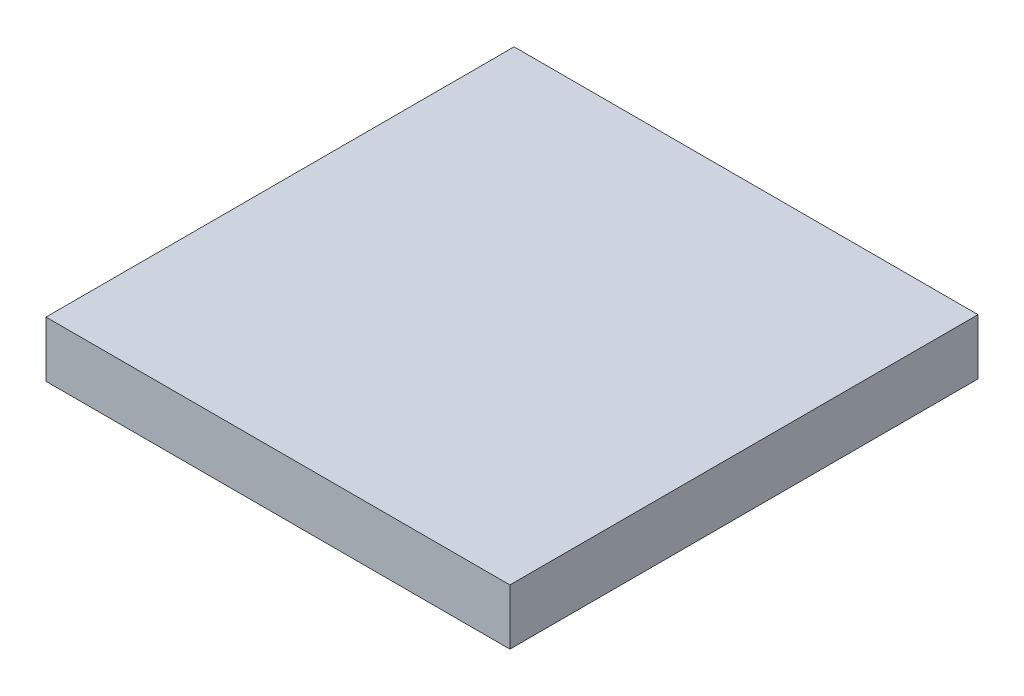
ISO-10303-21;
HEADER;
FILE_DESCRIPTION(('STEP AP214'),'2;1');
FILE_NAME('part.step','',(''),(''),'','','');
FILE_SCHEMA(('AUTOMOTIVE_DESIGN { 1 0 10303 214 1 1 1 1 }'));
ENDSEC;
DATA;
#1=APPLICATION_CONTEXT('core data for automotive mechanical design processes');
#2=APPLICATION_PROTOCOL_DEFINITION('international standard','automotive_design',2000,#1);
#3=PRODUCT_CONTEXT('',#1,'mechanical');
#4=PRODUCT('Part','Part','',(#3));
#5=PRODUCT_RELATED_PRODUCT_CATEGORY('part','',(#4));
#6=PRODUCT_DEFINITION_FORMATION('','',#4);
#7=PRODUCT_DEFINITION_CONTEXT('part definition',#1,'design');
#8=PRODUCT_DEFINITION('design','',#6,#7);
#9=PRODUCT_DEFINITION_SHAPE('','',#8);
#10=(LENGTH_UNIT() NAMED_UNIT(*) SI_UNIT(.MILLI.,.METRE.));
#11=(NAMED_UNIT(*) PLANE_ANGLE_UNIT() SI_UNIT($,.RADIAN.));
#12=(NAMED_UNIT(*) SI_UNIT($,.STERADIAN.) SOLID_ANGLE_UNIT());
#13=UNCERTAINTY_MEASURE_WITH_UNIT(LENGTH_MEASURE(1.E-05),#10,'distance_accuracy_value','');
#14=(GEOMETRIC_REPRESENTATION_CONTEXT(3) GLOBAL_UNCERTAINTY_ASSIGNED_CONTEXT((#13)) GLOBAL_UNIT_ASSIGNED_CONTEXT((#10,
#11,#12)) REPRESENTATION_CONTEXT('',''));
#15=CARTESIAN_POINT('',(0.,0.,0.));
#16=DIRECTION('',(0.,0.,1.));
#17=DIRECTION('',(1.,0.,0.));
#18=AXIS2_PLACEMENT_3D('',#15,#16,#17);
#19=CARTESIAN_POINT('',(20.,3.,20.));
#20=DIRECTION('',(0.,0.,1.));
#21=DIRECTION('',(1.,0.,0.));
#22=AXIS2_PLACEMENT_3D('',#19,#20,#21);
#23=PLANE('',#22);
#24=DIRECTION('',(-1.,0.,0.));
#25=VECTOR('',#24,1.);
#26=CARTESIAN_POINT('',(20.,0.,20.));
#27=LINE('',#26,#25);
#28=CARTESIAN_POINT('',(20.,0.,20.));
#29=VERTEX_POINT('',#28);
#30=CARTESIAN_POINT('',(-4.99999999999985,0.,20.));
#31=VERTEX_POINT('',#30);
#32=EDGE_CURVE('E119',#29,#31,#27,.T.);
#33=ORIENTED_EDGE('',*,*,#32,.F.);
#34=DIRECTION('',(0.,-1.,0.));
#35=VECTOR('',#34,1.);
#36=CARTESIAN_POINT('',(20.,3.,20.));
#37=LINE('',#36,#35);
#38=CARTESIAN_POINT('',(20.,3.,20.));
#39=VERTEX_POINT('',#38);
#40=EDGE_CURVE('E13',#39,#29,#37,.T.);
#41=ORIENTED_EDGE('',*,*,#40,.F.);
#42=DIRECTION('',(-1.,0.,0.));
#43=VECTOR('',#42,1.);
#44=CARTESIAN_POINT('',(20.,3.,20.));
#45=LINE('',#44,#43);
#46=CARTESIAN_POINT('',(-4.99999999999985,3.,20.));
#47=VERTEX_POINT('',#46);
#48=EDGE_CURVE('E113',#39,#47,#45,.T.);
#49=ORIENTED_EDGE('',*,*,#48,.T.);
#50=DIRECTION('',(0.,-1.,0.));
#51=VECTOR('',#50,1.);
#52=CARTESIAN_POINT('',(-4.99999999999985,3.,20.));
#53=LINE('',#52,#51);
#54=EDGE_CURVE('E92',#47,#31,#53,.T.);
#55=ORIENTED_EDGE('',*,*,#54,.T.);
#56=EDGE_LOOP('',(#33,#41,#49,#55));
#57=FACE_BOUND('',#56,.T.);
#58=ADVANCED_FACE('F51',(#57),#23,.T.);
#59=CARTESIAN_POINT('',(20.,3.,20.));
#60=DIRECTION('',(-1.,0.,0.));
#61=DIRECTION('',(0.,0.,1.));
#62=AXIS2_PLACEMENT_3D('',#59,#60,#61);
#63=PLANE('',#62);
#64=DIRECTION('',(0.,0.,-1.));
#65=VECTOR('',#64,1.);
#66=CARTESIAN_POINT('',(20.,0.,20.));
#67=LINE('',#66,#65);
#68=CARTESIAN_POINT('',(20.,0.,-5.22650515986531));
#69=VERTEX_POINT('',#68);
#70=EDGE_CURVE('E84',#29,#69,#67,.T.);
#71=ORIENTED_EDGE('',*,*,#70,.T.);
#72=DIRECTION('',(0.,-1.,0.));
#73=VECTOR('',#72,1.);
#74=CARTESIAN_POINT('',(20.,3.,-5.22650515986531));
#75=LINE('',#74,#73);
#76=CARTESIAN_POINT('',(20.,3.,-5.22650515986531));
#77=VERTEX_POINT('',#76);
#78=EDGE_CURVE('E60',#77,#69,#75,.T.);
#79=ORIENTED_EDGE('',*,*,#78,.F.);
#80=DIRECTION('',(0.,0.,-1.));
#81=VECTOR('',#80,1.);
#82=CARTESIAN_POINT('',(20.,3.,20.));
#83=LINE('',#82,#81);
#84=EDGE_CURVE('E102',#39,#77,#83,.T.);
#85=ORIENTED_EDGE('',*,*,#84,.F.);
#86=ORIENTED_EDGE('',*,*,#40,.T.);
#87=EDGE_LOOP('',(#71,#79,#85,#86));
#88=FACE_BOUND('',#87,.T.);
#89=ADVANCED_FACE('F242',(#88),#63,.F.);
#90=CARTESIAN_POINT('',(20.,3.,-5.22650515986531));
#91=DIRECTION('',(0.,0.,1.));
#92=DIRECTION('',(1.,0.,0.));
#93=AXIS2_PLACEMENT_3D('',#90,#91,#92);
#94=PLANE('',#93);
#95=DIRECTION('',(-1.,0.,0.));
#96=VECTOR('',#95,1.);
#97=CARTESIAN_POINT('',(20.,0.,-5.22650515986531));
#98=LINE('',#97,#96);
#99=CARTESIAN_POINT('',(-4.99999999999985,0.,-5.22650515986531));
#100=VERTEX_POINT('',#99);
#101=EDGE_CURVE('E109',#69,#100,#98,.T.);
#102=ORIENTED_EDGE('',*,*,#101,.T.);
#103=DIRECTION('',(0.,-1.,0.));
#104=VECTOR('',#103,1.);
#105=CARTESIAN_POINT('',(-4.99999999999985,3.,-5.22650515986531));
#106=LINE('',#105,#104);
#107=CARTESIAN_POINT('',(-4.99999999999985,3.,-5.22650515986531));
#108=VERTEX_POINT('',#107);
#109=EDGE_CURVE('E106',#108,#100,#106,.T.);
#110=ORIENTED_EDGE('',*,*,#109,.F.);
#111=DIRECTION('',(-1.,0.,0.));
#112=VECTOR('',#111,1.);
#113=CARTESIAN_POINT('',(20.,3.,-5.22650515986531));
#114=LINE('',#113,#112);
#115=EDGE_CURVE('E97',#77,#108,#114,.T.);
#116=ORIENTED_EDGE('',*,*,#115,.F.);
#117=ORIENTED_EDGE('',*,*,#78,.T.);
#118=EDGE_LOOP('',(#102,#110,#116,#117));
#119=FACE_BOUND('',#118,.T.);
#120=ADVANCED_FACE('F107',(#119),#94,.F.);
#121=CARTESIAN_POINT('',(-4.99999999999985,3.,20.));
#122=DIRECTION('',(-1.,0.,0.));
#123=DIRECTION('',(0.,0.,1.));
#124=AXIS2_PLACEMENT_3D('',#121,#122,#123);
#125=PLANE('',#124);
#126=DIRECTION('',(0.,0.,-1.));
#127=VECTOR('',#126,1.);
#128=CARTESIAN_POINT('',(-4.99999999999985,0.,20.));
#129=LINE('',#128,#127);
#130=EDGE_CURVE('E122',#31,#100,#129,.T.);
#131=ORIENTED_EDGE('',*,*,#130,.F.);
#132=ORIENTED_EDGE('',*,*,#54,.F.);
#133=DIRECTION('',(0.,0.,-1.));
#134=VECTOR('',#133,1.);
#135=CARTESIAN_POINT('',(-4.99999999999985,3.,20.));
#136=LINE('',#135,#134);
#137=EDGE_CURVE('E101',#47,#108,#136,.T.);
#138=ORIENTED_EDGE('',*,*,#137,.T.);
#139=ORIENTED_EDGE('',*,*,#109,.T.);
#140=EDGE_LOOP('',(#131,#132,#138,#139));
#141=FACE_BOUND('',#140,.T.);
#142=ADVANCED_FACE('F112',(#141),#125,.T.);
#143=CARTESIAN_POINT('',(0.,3.,0.));
#144=DIRECTION('',(0.,-1.,0.));
#145=DIRECTION('',(0.,0.,-1.));
#146=AXIS2_PLACEMENT_3D('',#143,#144,#145);
#147=PLANE('',#146);
#148=ORIENTED_EDGE('',*,*,#48,.F.);
#149=ORIENTED_EDGE('',*,*,#84,.T.);
#150=ORIENTED_EDGE('',*,*,#115,.T.);
#151=ORIENTED_EDGE('',*,*,#137,.F.);
#152=EDGE_LOOP('',(#148,#149,#150,#151));
#153=FACE_BOUND('',#152,.T.);
#154=ADVANCED_FACE('F100',(#153),#147,.F.);
#155=CARTESIAN_POINT('',(0.,0.,0.));
#156=DIRECTION('',(0.,-1.,0.));
#157=DIRECTION('',(0.,0.,-1.));
#158=AXIS2_PLACEMENT_3D('',#155,#156,#157);
#159=PLANE('',#158);
#160=CARTESIAN_POINT('',(1.54390389361936E-13,0.,7.27349484013469));
#161=DIRECTION('',(0.,1.,0.));
#162=DIRECTION('',(0.,0.,1.));
#163=AXIS2_PLACEMENT_3D('',#160,#161,#162);
#164=CIRCLE('',#163,2.5);
#165=CARTESIAN_POINT('',(1.54390389361936E-13,0.,9.77349484013469));
#166=VERTEX_POINT('',#165);
#167=EDGE_CURVE('E187',#166,#166,#164,.T.);
#168=ORIENTED_EDGE('',*,*,#167,.T.);
#169=EDGE_LOOP('',(#168));
#170=FACE_BOUND('',#169,.T.);
#171=CARTESIAN_POINT('',(15.0000000000002,0.,-0.226505159865314));
#172=DIRECTION('',(0.,1.,0.));
#173=DIRECTION('',(0.,0.,1.));
#174=AXIS2_PLACEMENT_3D('',#171,#172,#173);
#175=CIRCLE('',#174,2.5);
#176=CARTESIAN_POINT('',(15.0000000000002,0.,2.27349484013469));
#177=VERTEX_POINT('',#176);
#178=EDGE_CURVE('E174',#177,#177,#175,.T.);
#179=ORIENTED_EDGE('',*,*,#178,.T.);
#180=EDGE_LOOP('',(#179));
#181=FACE_BOUND('',#180,.T.);
#182=CARTESIAN_POINT('',(7.50000000000015,0.,-0.226505159865314));
#183=DIRECTION('',(0.,1.,0.));
#184=DIRECTION('',(0.,0.,1.));
#185=AXIS2_PLACEMENT_3D('',#182,#183,#184);
#186=CIRCLE('',#185,2.5);
#187=CARTESIAN_POINT('',(7.50000000000015,0.,2.27349484013469));
#188=VERTEX_POINT('',#187);
#189=EDGE_CURVE('E175',#188,#188,#186,.T.);
#190=ORIENTED_EDGE('',*,*,#189,.T.);
#191=EDGE_LOOP('',(#190));
#192=FACE_BOUND('',#191,.T.);
#193=CARTESIAN_POINT('',(1.54390389361936E-13,0.,-0.226505159865314));
#194=DIRECTION('',(0.,1.,0.));
#195=DIRECTION('',(0.,0.,1.));
#196=AXIS2_PLACEMENT_3D('',#193,#194,#195);
#197=CIRCLE('',#196,2.5);
#198=CARTESIAN_POINT('',(1.54390389361936E-13,0.,2.27349484013469));
#199=VERTEX_POINT('',#198);
#200=EDGE_CURVE('E132',#199,#199,#197,.T.);
#201=ORIENTED_EDGE('',*,*,#200,.T.);
#202=EDGE_LOOP('',(#201));
#203=FACE_BOUND('',#202,.T.);
#204=CARTESIAN_POINT('',(7.50000000000015,0.,7.27349484013469));
#205=DIRECTION('',(0.,1.,0.));
#206=DIRECTION('',(0.,0.,1.));
#207=AXIS2_PLACEMENT_3D('',#204,#205,#206);
#208=CIRCLE('',#207,2.5);
#209=CARTESIAN_POINT('',(7.50000000000015,0.,9.77349484013469));
#210=VERTEX_POINT('',#209);
#211=EDGE_CURVE('E186',#210,#210,#208,.T.);
#212=ORIENTED_EDGE('',*,*,#211,.T.);
#213=EDGE_LOOP('',(#212));
#214=FACE_BOUND('',#213,.T.);
#215=CARTESIAN_POINT('',(15.0000000000002,0.,7.27349484013469));
#216=DIRECTION('',(0.,1.,0.));
#217=DIRECTION('',(0.,0.,1.));
#218=AXIS2_PLACEMENT_3D('',#215,#216,#217);
#219=CIRCLE('',#218,2.5);
#220=CARTESIAN_POINT('',(15.0000000000002,0.,9.77349484013469));
#221=VERTEX_POINT('',#220);
#222=EDGE_CURVE('E205',#221,#221,#219,.T.);
#223=ORIENTED_EDGE('',*,*,#222,.T.);
#224=EDGE_LOOP('',(#223));
#225=FACE_BOUND('',#224,.T.);
#226=CARTESIAN_POINT('',(1.54390389361936E-13,0.,14.7734948401347));
#227=DIRECTION('',(0.,1.,0.));
#228=DIRECTION('',(0.,0.,1.));
#229=AXIS2_PLACEMENT_3D('',#226,#227,#228);
#230=CIRCLE('',#229,2.5);
#231=CARTESIAN_POINT('',(1.54390389361936E-13,0.,17.2734948401347));
#232=VERTEX_POINT('',#231);
#233=EDGE_CURVE('E199',#232,#232,#230,.T.);
#234=ORIENTED_EDGE('',*,*,#233,.T.);
#235=EDGE_LOOP('',(#234));
#236=FACE_BOUND('',#235,.T.);
#237=CARTESIAN_POINT('',(7.50000000000015,0.,14.7734948401347));
#238=DIRECTION('',(0.,1.,0.));
#239=DIRECTION('',(0.,0.,1.));
#240=AXIS2_PLACEMENT_3D('',#237,#238,#239);
#241=CIRCLE('',#240,2.5);
#242=CARTESIAN_POINT('',(7.50000000000015,0.,17.2734948401347));
#243=VERTEX_POINT('',#242);
#244=EDGE_CURVE('E198',#243,#243,#241,.T.);
#245=ORIENTED_EDGE('',*,*,#244,.T.);
#246=EDGE_LOOP('',(#245));
#247=FACE_BOUND('',#246,.T.);
#248=CARTESIAN_POINT('',(15.0000000000002,0.,14.7734948401347));
#249=DIRECTION('',(0.,1.,0.));
#250=DIRECTION('',(0.,0.,1.));
#251=AXIS2_PLACEMENT_3D('',#248,#249,#250);
#252=CIRCLE('',#251,2.5);
#253=CARTESIAN_POINT('',(15.0000000000002,0.,17.2734948401347));
#254=VERTEX_POINT('',#253);
#255=EDGE_CURVE('E216',#254,#254,#252,.T.);
#256=ORIENTED_EDGE('',*,*,#255,.T.);
#257=EDGE_LOOP('',(#256));
#258=FACE_BOUND('',#257,.T.);
#259=ORIENTED_EDGE('',*,*,#32,.T.);
#260=ORIENTED_EDGE('',*,*,#130,.T.);
#261=ORIENTED_EDGE('',*,*,#101,.F.);
#262=ORIENTED_EDGE('',*,*,#70,.F.);
#263=EDGE_LOOP('',(#259,#260,#261,#262));
#264=FACE_BOUND('',#263,.T.);
#265=ADVANCED_FACE('F223',(#170,#181,#192,#203,#214,#225,#236,#247,#258,#264),#159,.T.);
#266=CARTESIAN_POINT('',(15.0000000000002,2.,14.7734948401347));
#267=DIRECTION('',(0.,-1.,0.));
#268=DIRECTION('',(0.,0.,-1.));
#269=AXIS2_PLACEMENT_3D('',#266,#267,#268);
#270=CYLINDRICAL_SURFACE('',#269,2.5);
#271=CARTESIAN_POINT('',(15.0000000000002,2.,14.7734948401347));
#272=DIRECTION('',(0.,1.,0.));
#273=DIRECTION('',(0.,0.,1.));
#274=AXIS2_PLACEMENT_3D('',#271,#272,#273);
#275=CIRCLE('',#274,2.5);
#276=CARTESIAN_POINT('',(15.0000000000002,2.,17.2734948401347));
#277=VERTEX_POINT('',#276);
#278=EDGE_CURVE('E123',#277,#277,#275,.T.);
#279=ORIENTED_EDGE('',*,*,#278,.T.);
#280=EDGE_LOOP('',(#279));
#281=FACE_BOUND('',#280,.T.);
#282=ORIENTED_EDGE('',*,*,#255,.F.);
#283=EDGE_LOOP('',(#282));
#284=FACE_BOUND('',#283,.T.);
#285=ADVANCED_FACE('F226',(#281,#284),#270,.F.);
#286=CARTESIAN_POINT('',(15.0000000000002,2.,14.7734948401347));
#287=DIRECTION('',(0.,1.,0.));
#288=DIRECTION('',(0.,0.,1.));
#289=AXIS2_PLACEMENT_3D('',#286,#287,#288);
#290=PLANE('',#289);
#291=CARTESIAN_POINT('',(15.0000000000002,2.,14.7734948401347));
#292=DIRECTION('',(0.,1.,0.));
#293=DIRECTION('',(0.,0.,1.));
#294=AXIS2_PLACEMENT_3D('',#291,#292,#293);
#295=CIRCLE('',#294,1.5);
#296=CARTESIAN_POINT('',(15.0000000000002,2.,16.2734948401347));
#297=VERTEX_POINT('',#296);
#298=EDGE_CURVE('E129',#297,#297,#295,.F.);
#299=ORIENTED_EDGE('',*,*,#298,.F.);
#300=EDGE_LOOP('',(#299));
#301=FACE_BOUND('',#300,.T.);
#302=ORIENTED_EDGE('',*,*,#278,.F.);
#303=EDGE_LOOP('',(#302));
#304=FACE_BOUND('',#303,.T.);
#305=ADVANCED_FACE('F228',(#301,#304),#290,.F.);
#306=CARTESIAN_POINT('',(7.50000000000015,2.,14.7734948401347));
#307=DIRECTION('',(0.,-1.,0.));
#308=DIRECTION('',(0.,0.,-1.));
#309=AXIS2_PLACEMENT_3D('',#306,#307,#308);
#310=CYLINDRICAL_SURFACE('',#309,2.5);
#311=CARTESIAN_POINT('',(7.50000000000015,2.,14.7734948401347));
#312=DIRECTION('',(0.,1.,0.));
#313=DIRECTION('',(0.,0.,1.));
#314=AXIS2_PLACEMENT_3D('',#311,#312,#313);
#315=CIRCLE('',#314,2.5);
#316=CARTESIAN_POINT('',(7.50000000000015,2.,17.2734948401347));
#317=VERTEX_POINT('',#316);
#318=EDGE_CURVE('E213',#317,#317,#315,.T.);
#319=ORIENTED_EDGE('',*,*,#318,.T.);
#320=EDGE_LOOP('',(#319));
#321=FACE_BOUND('',#320,.T.);
#322=ORIENTED_EDGE('',*,*,#244,.F.);
#323=EDGE_LOOP('',(#322));
#324=FACE_BOUND('',#323,.T.);
#325=ADVANCED_FACE('F235',(#321,#324),#310,.F.);
#326=CARTESIAN_POINT('',(7.50000000000015,2.,14.7734948401347));
#327=DIRECTION('',(0.,1.,0.));
#328=DIRECTION('',(0.,0.,1.));
#329=AXIS2_PLACEMENT_3D('',#326,#327,#328);
#330=PLANE('',#329);
#331=CARTESIAN_POINT('',(7.50000000000015,2.,14.7734948401347));
#332=DIRECTION('',(0.,1.,0.));
#333=DIRECTION('',(0.,0.,1.));
#334=AXIS2_PLACEMENT_3D('',#331,#332,#333);
#335=CIRCLE('',#334,1.5);
#336=CARTESIAN_POINT('',(7.50000000000015,2.,16.2734948401347));
#337=VERTEX_POINT('',#336);
#338=EDGE_CURVE('E134',#337,#337,#335,.F.);
#339=ORIENTED_EDGE('',*,*,#338,.F.);
#340=EDGE_LOOP('',(#339));
#341=FACE_BOUND('',#340,.T.);
#342=ORIENTED_EDGE('',*,*,#318,.F.);
#343=EDGE_LOOP('',(#342));
#344=FACE_BOUND('',#343,.T.);
#345=ADVANCED_FACE('F355',(#341,#344),#330,.F.);
#346=CARTESIAN_POINT('',(1.54390389361936E-13,2.,14.7734948401347));
#347=DIRECTION('',(0.,-1.,0.));
#348=DIRECTION('',(0.,0.,-1.));
#349=AXIS2_PLACEMENT_3D('',#346,#347,#348);
#350=CYLINDRICAL_SURFACE('',#349,2.5);
#351=CARTESIAN_POINT('',(1.54390389361936E-13,2.,14.7734948401347));
#352=DIRECTION('',(0.,1.,0.));
#353=DIRECTION('',(0.,0.,1.));
#354=AXIS2_PLACEMENT_3D('',#351,#352,#353);
#355=CIRCLE('',#354,2.5);
#356=CARTESIAN_POINT('',(1.54390389361936E-13,2.,17.2734948401347));
#357=VERTEX_POINT('',#356);
#358=EDGE_CURVE('E195',#357,#357,#355,.T.);
#359=ORIENTED_EDGE('',*,*,#358,.T.);
#360=EDGE_LOOP('',(#359));
#361=FACE_BOUND('',#360,.T.);
#362=ORIENTED_EDGE('',*,*,#233,.F.);
#363=EDGE_LOOP('',(#362));
#364=FACE_BOUND('',#363,.T.);
#365=ADVANCED_FACE('F359',(#361,#364),#350,.F.);
#366=CARTESIAN_POINT('',(1.54390389361936E-13,2.,14.7734948401347));
#367=DIRECTION('',(0.,1.,0.));
#368=DIRECTION('',(0.,0.,1.));
#369=AXIS2_PLACEMENT_3D('',#366,#367,#368);
#370=PLANE('',#369);
#371=CARTESIAN_POINT('',(1.54390389361936E-13,2.,14.7734948401347));
#372=DIRECTION('',(0.,1.,0.));
#373=DIRECTION('',(0.,0.,1.));
#374=AXIS2_PLACEMENT_3D('',#371,#372,#373);
#375=CIRCLE('',#374,1.5);
#376=CARTESIAN_POINT('',(1.54390389361936E-13,2.,16.2734948401347));
#377=VERTEX_POINT('',#376);
#378=EDGE_CURVE('E54',#377,#377,#375,.F.);
#379=ORIENTED_EDGE('',*,*,#378,.F.);
#380=EDGE_LOOP('',(#379));
#381=FACE_BOUND('',#380,.T.);
#382=ORIENTED_EDGE('',*,*,#358,.F.);
#383=EDGE_LOOP('',(#382));
#384=FACE_BOUND('',#383,.T.);
#385=ADVANCED_FACE('F477',(#381,#384),#370,.F.);
#386=CARTESIAN_POINT('',(15.0000000000002,2.,7.27349484013469));
#387=DIRECTION('',(0.,-1.,0.));
#388=DIRECTION('',(0.,0.,-1.));
#389=AXIS2_PLACEMENT_3D('',#386,#387,#388);
#390=CYLINDRICAL_SURFACE('',#389,2.5);
#391=CARTESIAN_POINT('',(15.0000000000002,2.,7.27349484013469));
#392=DIRECTION('',(0.,1.,0.));
#393=DIRECTION('',(0.,0.,1.));
#394=AXIS2_PLACEMENT_3D('',#391,#392,#393);
#395=CIRCLE('',#394,2.5);
#396=CARTESIAN_POINT('',(15.0000000000002,2.,9.77349484013469));
#397=VERTEX_POINT('',#396);
#398=EDGE_CURVE('E202',#397,#397,#395,.T.);
#399=ORIENTED_EDGE('',*,*,#398,.T.);
#400=EDGE_LOOP('',(#399));
#401=FACE_BOUND('',#400,.T.);
#402=ORIENTED_EDGE('',*,*,#222,.F.);
#403=EDGE_LOOP('',(#402));
#404=FACE_BOUND('',#403,.T.);
#405=ADVANCED_FACE('F313',(#401,#404),#390,.F.);
#406=CARTESIAN_POINT('',(15.0000000000002,2.,7.27349484013469));
#407=DIRECTION('',(0.,1.,0.));
#408=DIRECTION('',(0.,0.,1.));
#409=AXIS2_PLACEMENT_3D('',#406,#407,#408);
#410=PLANE('',#409);
#411=CARTESIAN_POINT('',(15.0000000000002,2.,7.27349484013469));
#412=DIRECTION('',(0.,1.,0.));
#413=DIRECTION('',(0.,0.,1.));
#414=AXIS2_PLACEMENT_3D('',#411,#412,#413);
#415=CIRCLE('',#414,1.5);
#416=CARTESIAN_POINT('',(15.0000000000002,2.,8.77349484013468));
#417=VERTEX_POINT('',#416);
#418=EDGE_CURVE('E153',#417,#417,#415,.F.);
#419=ORIENTED_EDGE('',*,*,#418,.F.);
#420=EDGE_LOOP('',(#419));
#421=FACE_BOUND('',#420,.T.);
#422=ORIENTED_EDGE('',*,*,#398,.F.);
#423=EDGE_LOOP('',(#422));
#424=FACE_BOUND('',#423,.T.);
#425=ADVANCED_FACE('F307',(#421,#424),#410,.F.);
#426=CARTESIAN_POINT('',(7.50000000000015,2.,7.27349484013469));
#427=DIRECTION('',(0.,-1.,0.));
#428=DIRECTION('',(0.,0.,-1.));
#429=AXIS2_PLACEMENT_3D('',#426,#427,#428);
#430=CYLINDRICAL_SURFACE('',#429,2.5);
#431=CARTESIAN_POINT('',(7.50000000000015,2.,7.27349484013469));
#432=DIRECTION('',(0.,1.,0.));
#433=DIRECTION('',(0.,0.,1.));
#434=AXIS2_PLACEMENT_3D('',#431,#432,#433);
#435=CIRCLE('',#434,2.5);
#436=CARTESIAN_POINT('',(7.50000000000015,2.,9.77349484013469));
#437=VERTEX_POINT('',#436);
#438=EDGE_CURVE('E208',#437,#437,#435,.T.);
#439=ORIENTED_EDGE('',*,*,#438,.T.);
#440=EDGE_LOOP('',(#439));
#441=FACE_BOUND('',#440,.T.);
#442=ORIENTED_EDGE('',*,*,#211,.F.);
#443=EDGE_LOOP('',(#442));
#444=FACE_BOUND('',#443,.T.);
#445=ADVANCED_FACE('F312',(#441,#444),#430,.F.);
#446=CARTESIAN_POINT('',(7.50000000000015,2.,7.27349484013469));
#447=DIRECTION('',(0.,1.,0.));
#448=DIRECTION('',(0.,0.,1.));
#449=AXIS2_PLACEMENT_3D('',#446,#447,#448);
#450=PLANE('',#449);
#451=CARTESIAN_POINT('',(7.50000000000015,2.,7.27349484013469));
#452=DIRECTION('',(0.,1.,0.));
#453=DIRECTION('',(0.,0.,1.));
#454=AXIS2_PLACEMENT_3D('',#451,#452,#453);
#455=CIRCLE('',#454,1.5);
#456=CARTESIAN_POINT('',(7.50000000000015,2.,8.77349484013468));
#457=VERTEX_POINT('',#456);
#458=EDGE_CURVE('E151',#457,#457,#455,.F.);
#459=ORIENTED_EDGE('',*,*,#458,.F.);
#460=EDGE_LOOP('',(#459));
#461=FACE_BOUND('',#460,.T.);
#462=ORIENTED_EDGE('',*,*,#438,.F.);
#463=EDGE_LOOP('',(#462));
#464=FACE_BOUND('',#463,.T.);
#465=ADVANCED_FACE('F393',(#461,#464),#450,.F.);
#466=CARTESIAN_POINT('',(1.54390389361936E-13,2.,-0.226505159865314));
#467=DIRECTION('',(0.,-1.,0.));
#468=DIRECTION('',(0.,0.,-1.));
#469=AXIS2_PLACEMENT_3D('',#466,#467,#468);
#470=CYLINDRICAL_SURFACE('',#469,2.5);
#471=CARTESIAN_POINT('',(1.54390389361936E-13,2.,-0.226505159865314));
#472=DIRECTION('',(0.,1.,0.));
#473=DIRECTION('',(0.,0.,1.));
#474=AXIS2_PLACEMENT_3D('',#471,#472,#473);
#475=CIRCLE('',#474,2.5);
#476=CARTESIAN_POINT('',(1.54390389361936E-13,2.,2.27349484013469));
#477=VERTEX_POINT('',#476);
#478=EDGE_CURVE('E178',#477,#477,#475,.T.);
#479=ORIENTED_EDGE('',*,*,#478,.T.);
#480=EDGE_LOOP('',(#479));
#481=FACE_BOUND('',#480,.T.);
#482=ORIENTED_EDGE('',*,*,#200,.F.);
#483=EDGE_LOOP('',(#482));
#484=FACE_BOUND('',#483,.T.);
#485=ADVANCED_FACE('F397',(#481,#484),#470,.F.);
#486=CARTESIAN_POINT('',(1.54390389361936E-13,2.,-0.226505159865314));
#487=DIRECTION('',(0.,1.,0.));
#488=DIRECTION('',(0.,0.,1.));
#489=AXIS2_PLACEMENT_3D('',#486,#487,#488);
#490=PLANE('',#489);
#491=CARTESIAN_POINT('',(1.54390389361936E-13,2.,-0.226505159865314));
#492=DIRECTION('',(0.,1.,0.));
#493=DIRECTION('',(0.,0.,1.));
#494=AXIS2_PLACEMENT_3D('',#491,#492,#493);
#495=CIRCLE('',#494,1.5);
#496=CARTESIAN_POINT('',(1.54390389361936E-13,2.,1.27349484013468));
#497=VERTEX_POINT('',#496);
#498=EDGE_CURVE('E148',#497,#497,#495,.F.);
#499=ORIENTED_EDGE('',*,*,#498,.F.);
#500=EDGE_LOOP('',(#499));
#501=FACE_BOUND('',#500,.T.);
#502=ORIENTED_EDGE('',*,*,#478,.F.);
#503=EDGE_LOOP('',(#502));
#504=FACE_BOUND('',#503,.T.);
#505=ADVANCED_FACE('F439',(#501,#504),#490,.F.);
#506=CARTESIAN_POINT('',(7.50000000000015,2.,-0.226505159865314));
#507=DIRECTION('',(0.,-1.,0.));
#508=DIRECTION('',(0.,0.,-1.));
#509=AXIS2_PLACEMENT_3D('',#506,#507,#508);
#510=CYLINDRICAL_SURFACE('',#509,2.5);
#511=CARTESIAN_POINT('',(7.50000000000015,2.,-0.226505159865314));
#512=DIRECTION('',(0.,1.,0.));
#513=DIRECTION('',(0.,0.,1.));
#514=AXIS2_PLACEMENT_3D('',#511,#512,#513);
#515=CIRCLE('',#514,2.5);
#516=CARTESIAN_POINT('',(7.50000000000015,2.,2.27349484013469));
#517=VERTEX_POINT('',#516);
#518=EDGE_CURVE('E170',#517,#517,#515,.T.);
#519=ORIENTED_EDGE('',*,*,#518,.T.);
#520=EDGE_LOOP('',(#519));
#521=FACE_BOUND('',#520,.T.);
#522=ORIENTED_EDGE('',*,*,#189,.F.);
#523=EDGE_LOOP('',(#522));
#524=FACE_BOUND('',#523,.T.);
#525=ADVANCED_FACE('F422',(#521,#524),#510,.F.);
#526=CARTESIAN_POINT('',(7.50000000000015,2.,-0.226505159865314));
#527=DIRECTION('',(0.,1.,0.));
#528=DIRECTION('',(0.,0.,1.));
#529=AXIS2_PLACEMENT_3D('',#526,#527,#528);
#530=PLANE('',#529);
#531=CARTESIAN_POINT('',(7.50000000000015,2.,-0.226505159865314));
#532=DIRECTION('',(0.,1.,0.));
#533=DIRECTION('',(0.,0.,1.));
#534=AXIS2_PLACEMENT_3D('',#531,#532,#533);
#535=CIRCLE('',#534,1.5);
#536=CARTESIAN_POINT('',(7.50000000000015,2.,1.27349484013468));
#537=VERTEX_POINT('',#536);
#538=EDGE_CURVE('E145',#537,#537,#535,.F.);
#539=ORIENTED_EDGE('',*,*,#538,.F.);
#540=EDGE_LOOP('',(#539));
#541=FACE_BOUND('',#540,.T.);
#542=ORIENTED_EDGE('',*,*,#518,.F.);
#543=EDGE_LOOP('',(#542));
#544=FACE_BOUND('',#543,.T.);
#545=ADVANCED_FACE('F418',(#541,#544),#530,.F.);
#546=CARTESIAN_POINT('',(15.0000000000002,2.,-0.226505159865314));
#547=DIRECTION('',(0.,-1.,0.));
#548=DIRECTION('',(0.,0.,-1.));
#549=AXIS2_PLACEMENT_3D('',#546,#547,#548);
#550=CYLINDRICAL_SURFACE('',#549,2.5);
#551=CARTESIAN_POINT('',(15.0000000000002,2.,-0.226505159865314));
#552=DIRECTION('',(0.,1.,0.));
#553=DIRECTION('',(0.,0.,1.));
#554=AXIS2_PLACEMENT_3D('',#551,#552,#553);
#555=CIRCLE('',#554,2.5);
#556=CARTESIAN_POINT('',(15.0000000000002,2.,2.27349484013469));
#557=VERTEX_POINT('',#556);
#558=EDGE_CURVE('E190',#557,#557,#555,.T.);
#559=ORIENTED_EDGE('',*,*,#558,.T.);
#560=EDGE_LOOP('',(#559));
#561=FACE_BOUND('',#560,.T.);
#562=ORIENTED_EDGE('',*,*,#178,.F.);
#563=EDGE_LOOP('',(#562));
#564=FACE_BOUND('',#563,.T.);
#565=ADVANCED_FACE('F345',(#561,#564),#550,.F.);
#566=CARTESIAN_POINT('',(15.0000000000002,2.,-0.226505159865314));
#567=DIRECTION('',(0.,1.,0.));
#568=DIRECTION('',(0.,0.,1.));
#569=AXIS2_PLACEMENT_3D('',#566,#567,#568);
#570=PLANE('',#569);
#571=CARTESIAN_POINT('',(15.0000000000002,2.,-0.226505159865314));
#572=DIRECTION('',(0.,1.,0.));
#573=DIRECTION('',(0.,0.,1.));
#574=AXIS2_PLACEMENT_3D('',#571,#572,#573);
#575=CIRCLE('',#574,1.5);
#576=CARTESIAN_POINT('',(15.0000000000002,2.,1.27349484013468));
#577=VERTEX_POINT('',#576);
#578=EDGE_CURVE('E141',#577,#577,#575,.F.);
#579=ORIENTED_EDGE('',*,*,#578,.F.);
#580=EDGE_LOOP('',(#579));
#581=FACE_BOUND('',#580,.T.);
#582=ORIENTED_EDGE('',*,*,#558,.F.);
#583=EDGE_LOOP('',(#582));
#584=FACE_BOUND('',#583,.T.);
#585=ADVANCED_FACE('F339',(#581,#584),#570,.F.);
#586=CARTESIAN_POINT('',(1.54390389361936E-13,2.,7.27349484013469));
#587=DIRECTION('',(0.,-1.,0.));
#588=DIRECTION('',(0.,0.,-1.));
#589=AXIS2_PLACEMENT_3D('',#586,#587,#588);
#590=CYLINDRICAL_SURFACE('',#589,2.5);
#591=CARTESIAN_POINT('',(1.54390389361936E-13,2.,7.27349484013469));
#592=DIRECTION('',(0.,1.,0.));
#593=DIRECTION('',(0.,0.,1.));
#594=AXIS2_PLACEMENT_3D('',#591,#592,#593);
#595=CIRCLE('',#594,2.5);
#596=CARTESIAN_POINT('',(1.54390389361936E-13,2.,9.77349484013469));
#597=VERTEX_POINT('',#596);
#598=EDGE_CURVE('E183',#597,#597,#595,.T.);
#599=ORIENTED_EDGE('',*,*,#598,.T.);
#600=EDGE_LOOP('',(#599));
#601=FACE_BOUND('',#600,.T.);
#602=ORIENTED_EDGE('',*,*,#167,.F.);
#603=EDGE_LOOP('',(#602));
#604=FACE_BOUND('',#603,.T.);
#605=ADVANCED_FACE('F344',(#601,#604),#590,.F.);
#606=CARTESIAN_POINT('',(1.54390389361936E-13,2.,7.27349484013469));
#607=DIRECTION('',(0.,1.,0.));
#608=DIRECTION('',(0.,0.,1.));
#609=AXIS2_PLACEMENT_3D('',#606,#607,#608);
#610=PLANE('',#609);
#611=CARTESIAN_POINT('',(1.54390389361936E-13,2.,7.27349484013469));
#612=DIRECTION('',(0.,1.,0.));
#613=DIRECTION('',(0.,0.,1.));
#614=AXIS2_PLACEMENT_3D('',#611,#612,#613);
#615=CIRCLE('',#614,1.5);
#616=CARTESIAN_POINT('',(1.54390389361936E-13,2.,8.77349484013468));
#617=VERTEX_POINT('',#616);
#618=EDGE_CURVE('E138',#617,#617,#615,.F.);
#619=ORIENTED_EDGE('',*,*,#618,.F.);
#620=EDGE_LOOP('',(#619));
#621=FACE_BOUND('',#620,.T.);
#622=ORIENTED_EDGE('',*,*,#598,.F.);
#623=EDGE_LOOP('',(#622));
#624=FACE_BOUND('',#623,.T.);
#625=ADVANCED_FACE('F458',(#621,#624),#610,.F.);
#626=CARTESIAN_POINT('',(15.0000000000002,2.5,14.7734948401347));
#627=DIRECTION('',(0.,-1.,0.));
#628=DIRECTION('',(0.,0.,-1.));
#629=AXIS2_PLACEMENT_3D('',#626,#627,#628);
#630=CYLINDRICAL_SURFACE('',#629,1.5);
#631=CARTESIAN_POINT('',(15.0000000000002,2.5,14.7734948401347));
#632=DIRECTION('',(0.,1.,0.));
#633=DIRECTION('',(0.,0.,1.));
#634=AXIS2_PLACEMENT_3D('',#631,#632,#633);
#635=CIRCLE('',#634,1.5);
#636=CARTESIAN_POINT('',(15.0000000000002,2.5,16.2734948401347));
#637=VERTEX_POINT('',#636);
#638=EDGE_CURVE('E133',#637,#637,#635,.T.);
#639=ORIENTED_EDGE('',*,*,#638,.T.);
#640=EDGE_LOOP('',(#639));
#641=FACE_BOUND('',#640,.T.);
#642=ORIENTED_EDGE('',*,*,#298,.T.);
#643=EDGE_LOOP('',(#642));
#644=FACE_BOUND('',#643,.T.);
#645=ADVANCED_FACE('F282',(#641,#644),#630,.F.);
#646=CARTESIAN_POINT('',(15.0000000000002,2.5,14.7734948401347));
#647=DIRECTION('',(0.,1.,0.));
#648=DIRECTION('',(0.,0.,1.));
#649=AXIS2_PLACEMENT_3D('',#646,#647,#648);
#650=PLANE('',#649);
#651=ORIENTED_EDGE('',*,*,#638,.F.);
#652=EDGE_LOOP('',(#651));
#653=FACE_BOUND('',#652,.T.);
#654=ADVANCED_FACE('F276',(#653),#650,.F.);
#655=CARTESIAN_POINT('',(7.50000000000015,2.5,14.7734948401347));
#656=DIRECTION('',(0.,-1.,0.));
#657=DIRECTION('',(0.,0.,-1.));
#658=AXIS2_PLACEMENT_3D('',#655,#656,#657);
#659=CYLINDRICAL_SURFACE('',#658,1.5);
#660=CARTESIAN_POINT('',(7.50000000000015,2.5,14.7734948401347));
#661=DIRECTION('',(0.,1.,0.));
#662=DIRECTION('',(0.,0.,1.));
#663=AXIS2_PLACEMENT_3D('',#660,#661,#662);
#664=CIRCLE('',#663,1.5);
#665=CARTESIAN_POINT('',(7.50000000000015,2.5,16.2734948401347));
#666=VERTEX_POINT('',#665);
#667=EDGE_CURVE('E137',#666,#666,#664,.T.);
#668=ORIENTED_EDGE('',*,*,#667,.T.);
#669=EDGE_LOOP('',(#668));
#670=FACE_BOUND('',#669,.T.);
#671=ORIENTED_EDGE('',*,*,#338,.T.);
#672=EDGE_LOOP('',(#671));
#673=FACE_BOUND('',#672,.T.);
#674=ADVANCED_FACE('F281',(#670,#673),#659,.F.);
#675=CARTESIAN_POINT('',(7.50000000000015,2.5,14.7734948401347));
#676=DIRECTION('',(0.,1.,0.));
#677=DIRECTION('',(0.,0.,1.));
#678=AXIS2_PLACEMENT_3D('',#675,#676,#677);
#679=PLANE('',#678);
#680=ORIENTED_EDGE('',*,*,#667,.F.);
#681=EDGE_LOOP('',(#680));
#682=FACE_BOUND('',#681,.T.);
#683=ADVANCED_FACE('F366',(#682),#679,.F.);
#684=CARTESIAN_POINT('',(1.54390389361936E-13,2.5,7.27349484013469));
#685=DIRECTION('',(0.,-1.,0.));
#686=DIRECTION('',(0.,0.,-1.));
#687=AXIS2_PLACEMENT_3D('',#684,#685,#686);
#688=CYLINDRICAL_SURFACE('',#687,1.5);
#689=CARTESIAN_POINT('',(1.54390389361936E-13,2.5,7.27349484013469));
#690=DIRECTION('',(0.,1.,0.));
#691=DIRECTION('',(0.,0.,1.));
#692=AXIS2_PLACEMENT_3D('',#689,#690,#691);
#693=CIRCLE('',#692,1.5);
#694=CARTESIAN_POINT('',(1.54390389361936E-13,2.5,8.77349484013468));
#695=VERTEX_POINT('',#694);
#696=EDGE_CURVE('E674',#695,#695,#693,.T.);
#697=ORIENTED_EDGE('',*,*,#696,.T.);
#698=EDGE_LOOP('',(#697));
#699=FACE_BOUND('',#698,.T.);
#700=ORIENTED_EDGE('',*,*,#618,.T.);
#701=EDGE_LOOP('',(#700));
#702=FACE_BOUND('',#701,.T.);
#703=ADVANCED_FACE('F371',(#699,#702),#688,.F.);
#704=CARTESIAN_POINT('',(1.54390389361936E-13,2.5,7.27349484013469));
#705=DIRECTION('',(0.,1.,0.));
#706=DIRECTION('',(0.,0.,1.));
#707=AXIS2_PLACEMENT_3D('',#704,#705,#706);
#708=PLANE('',#707);
#709=ORIENTED_EDGE('',*,*,#696,.F.);
#710=EDGE_LOOP('',(#709));
#711=FACE_BOUND('',#710,.T.);
#712=ADVANCED_FACE('F448',(#711),#708,.F.);
#713=CARTESIAN_POINT('',(15.0000000000002,2.5,-0.226505159865314));
#714=DIRECTION('',(0.,-1.,0.));
#715=DIRECTION('',(0.,0.,-1.));
#716=AXIS2_PLACEMENT_3D('',#713,#714,#715);
#717=CYLINDRICAL_SURFACE('',#716,1.5);
#718=CARTESIAN_POINT('',(15.0000000000002,2.5,-0.226505159865314));
#719=DIRECTION('',(0.,1.,0.));
#720=DIRECTION('',(0.,0.,1.));
#721=AXIS2_PLACEMENT_3D('',#718,#719,#720);
#722=CIRCLE('',#721,1.5);
#723=CARTESIAN_POINT('',(15.0000000000002,2.5,1.27349484013468));
#724=VERTEX_POINT('',#723);
#725=EDGE_CURVE('E671',#724,#724,#722,.T.);
#726=ORIENTED_EDGE('',*,*,#725,.T.);
#727=EDGE_LOOP('',(#726));
#728=FACE_BOUND('',#727,.T.);
#729=ORIENTED_EDGE('',*,*,#578,.T.);
#730=EDGE_LOOP('',(#729));
#731=FACE_BOUND('',#730,.T.);
#732=ADVANCED_FACE('F329',(#728,#731),#717,.F.);
#733=CARTESIAN_POINT('',(15.0000000000002,2.5,-0.226505159865314));
#734=DIRECTION('',(0.,1.,0.));
#735=DIRECTION('',(0.,0.,1.));
#736=AXIS2_PLACEMENT_3D('',#733,#734,#735);
#737=PLANE('',#736);
#738=ORIENTED_EDGE('',*,*,#725,.F.);
#739=EDGE_LOOP('',(#738));
#740=FACE_BOUND('',#739,.T.);
#741=ADVANCED_FACE('F323',(#740),#737,.F.);
#742=CARTESIAN_POINT('',(7.50000000000015,2.5,-0.226505159865314));
#743=DIRECTION('',(0.,-1.,0.));
#744=DIRECTION('',(0.,0.,-1.));
#745=AXIS2_PLACEMENT_3D('',#742,#743,#744);
#746=CYLINDRICAL_SURFACE('',#745,1.5);
#747=CARTESIAN_POINT('',(7.50000000000015,2.5,-0.226505159865314));
#748=DIRECTION('',(0.,1.,0.));
#749=DIRECTION('',(0.,0.,1.));
#750=AXIS2_PLACEMENT_3D('',#747,#748,#749);
#751=CIRCLE('',#750,1.5);
#752=CARTESIAN_POINT('',(7.50000000000015,2.5,1.27349484013468));
#753=VERTEX_POINT('',#752);
#754=EDGE_CURVE('E675',#753,#753,#751,.T.);
#755=ORIENTED_EDGE('',*,*,#754,.T.);
#756=EDGE_LOOP('',(#755));
#757=FACE_BOUND('',#756,.T.);
#758=ORIENTED_EDGE('',*,*,#538,.T.);
#759=EDGE_LOOP('',(#758));
#760=FACE_BOUND('',#759,.T.);
#761=ADVANCED_FACE('F328',(#757,#760),#746,.F.);
#762=CARTESIAN_POINT('',(7.50000000000015,2.5,-0.226505159865314));
#763=DIRECTION('',(0.,1.,0.));
#764=DIRECTION('',(0.,0.,1.));
#765=AXIS2_PLACEMENT_3D('',#762,#763,#764);
#766=PLANE('',#765);
#767=ORIENTED_EDGE('',*,*,#754,.F.);
#768=EDGE_LOOP('',(#767));
#769=FACE_BOUND('',#768,.T.);
#770=ADVANCED_FACE('F405',(#769),#766,.F.);
#771=CARTESIAN_POINT('',(1.54390389361936E-13,2.5,-0.226505159865314));
#772=DIRECTION('',(0.,-1.,0.));
#773=DIRECTION('',(0.,0.,-1.));
#774=AXIS2_PLACEMENT_3D('',#771,#772,#773);
#775=CYLINDRICAL_SURFACE('',#774,1.5);
#776=CARTESIAN_POINT('',(1.54390389361936E-13,2.5,-0.226505159865314));
#777=DIRECTION('',(0.,1.,0.));
#778=DIRECTION('',(0.,0.,1.));
#779=AXIS2_PLACEMENT_3D('',#776,#777,#778);
#780=CIRCLE('',#779,1.5);
#781=CARTESIAN_POINT('',(1.54390389361936E-13,2.5,1.27349484013468));
#782=VERTEX_POINT('',#781);
#783=EDGE_CURVE('E678',#782,#782,#780,.T.);
#784=ORIENTED_EDGE('',*,*,#783,.T.);
#785=EDGE_LOOP('',(#784));
#786=FACE_BOUND('',#785,.T.);
#787=ORIENTED_EDGE('',*,*,#498,.T.);
#788=EDGE_LOOP('',(#787));
#789=FACE_BOUND('',#788,.T.);
#790=ADVANCED_FACE('F410',(#786,#789),#775,.F.);
#791=CARTESIAN_POINT('',(1.54390389361936E-13,2.5,-0.226505159865314));
#792=DIRECTION('',(0.,1.,0.));
#793=DIRECTION('',(0.,0.,1.));
#794=AXIS2_PLACEMENT_3D('',#791,#792,#793);
#795=PLANE('',#794);
#796=ORIENTED_EDGE('',*,*,#783,.F.);
#797=EDGE_LOOP('',(#796));
#798=FACE_BOUND('',#797,.T.);
#799=ADVANCED_FACE('F429',(#798),#795,.F.);
#800=CARTESIAN_POINT('',(7.50000000000015,2.5,7.27349484013469));
#801=DIRECTION('',(0.,-1.,0.));
#802=DIRECTION('',(0.,0.,-1.));
#803=AXIS2_PLACEMENT_3D('',#800,#801,#802);
#804=CYLINDRICAL_SURFACE('',#803,1.5);
#805=CARTESIAN_POINT('',(7.50000000000015,2.5,7.27349484013469));
#806=DIRECTION('',(0.,1.,0.));
#807=DIRECTION('',(0.,0.,1.));
#808=AXIS2_PLACEMENT_3D('',#805,#806,#807);
#809=CIRCLE('',#808,1.5);
#810=CARTESIAN_POINT('',(7.50000000000015,2.5,8.77349484013468));
#811=VERTEX_POINT('',#810);
#812=EDGE_CURVE('E166',#811,#811,#809,.T.);
#813=ORIENTED_EDGE('',*,*,#812,.T.);
#814=EDGE_LOOP('',(#813));
#815=FACE_BOUND('',#814,.T.);
#816=ORIENTED_EDGE('',*,*,#458,.T.);
#817=EDGE_LOOP('',(#816));
#818=FACE_BOUND('',#817,.T.);
#819=ADVANCED_FACE('F385',(#815,#818),#804,.F.);
#820=CARTESIAN_POINT('',(7.50000000000015,2.5,7.27349484013469));
#821=DIRECTION('',(0.,1.,0.));
#822=DIRECTION('',(0.,0.,1.));
#823=AXIS2_PLACEMENT_3D('',#820,#821,#822);
#824=PLANE('',#823);
#825=ORIENTED_EDGE('',*,*,#812,.F.);
#826=EDGE_LOOP('',(#825));
#827=FACE_BOUND('',#826,.T.);
#828=ADVANCED_FACE('F380',(#827),#824,.F.);
#829=CARTESIAN_POINT('',(15.0000000000002,2.5,7.27349484013469));
#830=DIRECTION('',(0.,-1.,0.));
#831=DIRECTION('',(0.,0.,-1.));
#832=AXIS2_PLACEMENT_3D('',#829,#830,#831);
#833=CYLINDRICAL_SURFACE('',#832,1.5);
#834=CARTESIAN_POINT('',(15.0000000000002,2.5,7.27349484013469));
#835=DIRECTION('',(0.,1.,0.));
#836=DIRECTION('',(0.,0.,1.));
#837=AXIS2_PLACEMENT_3D('',#834,#835,#836);
#838=CIRCLE('',#837,1.5);
#839=CARTESIAN_POINT('',(15.0000000000002,2.5,8.77349484013468));
#840=VERTEX_POINT('',#839);
#841=EDGE_CURVE('E667',#840,#840,#838,.T.);
#842=ORIENTED_EDGE('',*,*,#841,.T.);
#843=EDGE_LOOP('',(#842));
#844=FACE_BOUND('',#843,.T.);
#845=ORIENTED_EDGE('',*,*,#418,.T.);
#846=EDGE_LOOP('',(#845));
#847=FACE_BOUND('',#846,.T.);
#848=ADVANCED_FACE('F297',(#844,#847),#833,.F.);
#849=CARTESIAN_POINT('',(15.0000000000002,2.5,7.27349484013469));
#850=DIRECTION('',(0.,1.,0.));
#851=DIRECTION('',(0.,0.,1.));
#852=AXIS2_PLACEMENT_3D('',#849,#850,#851);
#853=PLANE('',#852);
#854=ORIENTED_EDGE('',*,*,#841,.F.);
#855=EDGE_LOOP('',(#854));
#856=FACE_BOUND('',#855,.T.);
#857=ADVANCED_FACE('F291',(#856),#853,.F.);
#858=CARTESIAN_POINT('',(1.54390389361936E-13,2.5,14.7734948401347));
#859=DIRECTION('',(0.,-1.,0.));
#860=DIRECTION('',(0.,0.,-1.));
#861=AXIS2_PLACEMENT_3D('',#858,#859,#860);
#862=CYLINDRICAL_SURFACE('',#861,1.5);
#863=CARTESIAN_POINT('',(1.54390389361936E-13,2.5,14.7734948401347));
#864=DIRECTION('',(0.,1.,0.));
#865=DIRECTION('',(0.,0.,1.));
#866=AXIS2_PLACEMENT_3D('',#863,#864,#865);
#867=CIRCLE('',#866,1.5);
#868=CARTESIAN_POINT('',(1.54390389361936E-13,2.5,16.2734948401347));
#869=VERTEX_POINT('',#868);
#870=EDGE_CURVE('E142',#869,#869,#867,.T.);
#871=ORIENTED_EDGE('',*,*,#870,.T.);
#872=EDGE_LOOP('',(#871));
#873=FACE_BOUND('',#872,.T.);
#874=ORIENTED_EDGE('',*,*,#378,.T.);
#875=EDGE_LOOP('',(#874));
#876=FACE_BOUND('',#875,.T.);
#877=ADVANCED_FACE('F296',(#873,#876),#862,.F.);
#878=CARTESIAN_POINT('',(1.54390389361936E-13,2.5,14.7734948401347));
#879=DIRECTION('',(0.,1.,0.));
#880=DIRECTION('',(0.,0.,1.));
#881=AXIS2_PLACEMENT_3D('',#878,#879,#880);
#882=PLANE('',#881);
#883=ORIENTED_EDGE('',*,*,#870,.F.);
#884=EDGE_LOOP('',(#883));
#885=FACE_BOUND('',#884,.T.);
#886=ADVANCED_FACE('F467',(#885),#882,.F.);
#887=CLOSED_SHELL('',(#58,#89,#120,#142,#154,#265,#285,#305,#325,#345,#365,#385,#405,#425,#445,
#465,#485,#505,#525,#545,#565,#585,#605,#625,#645,#654,#674,#683,#703,#712,#732,#741,#761,#770,
#790,#799,#819,#828,#848,#857,#877,#886));
#888=MANIFOLD_SOLID_BREP('B2',#887);
#889=ADVANCED_BREP_SHAPE_REPRESENTATION('',(#18,#888),#14);
#890=SHAPE_DEFINITION_REPRESENTATION(#9,#889);
ENDSEC;
END-ISO-10303-21;
